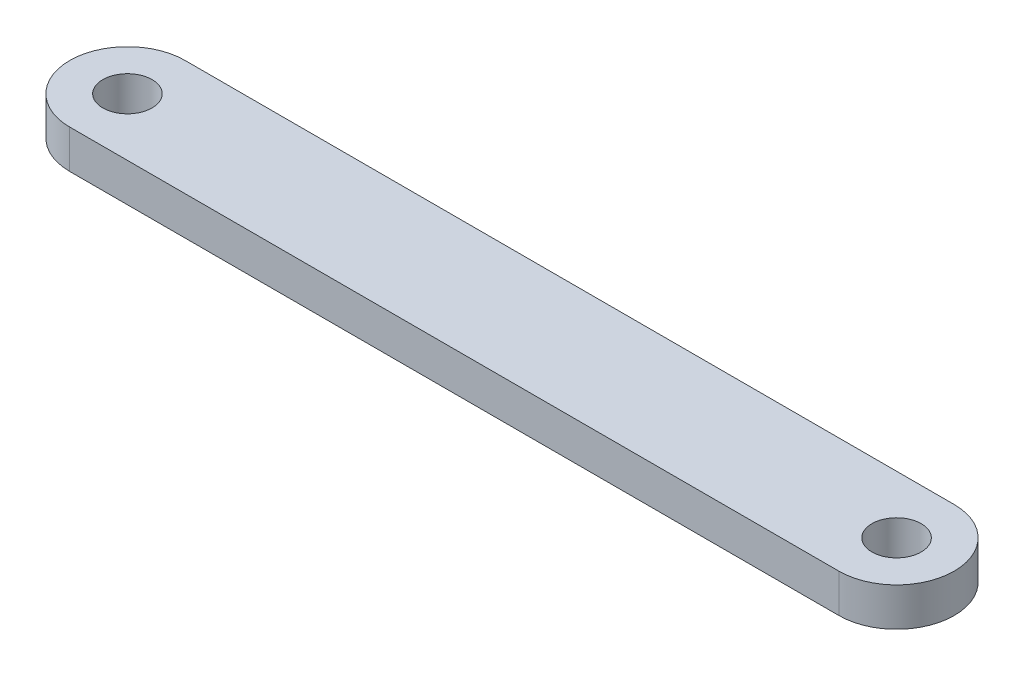
ISO-10303-21;
HEADER;
FILE_DESCRIPTION(('STEP AP214'),'2;1');
FILE_NAME('part.step','',(''),(''),'','','');
FILE_SCHEMA(('AUTOMOTIVE_DESIGN { 1 0 10303 214 1 1 1 1 }'));
ENDSEC;
DATA;
#1=APPLICATION_CONTEXT('core data for automotive mechanical design processes');
#2=APPLICATION_PROTOCOL_DEFINITION('international standard','automotive_design',2000,#1);
#3=PRODUCT_CONTEXT('',#1,'mechanical');
#4=PRODUCT('Part','Part','',(#3));
#5=PRODUCT_RELATED_PRODUCT_CATEGORY('part','',(#4));
#6=PRODUCT_DEFINITION_FORMATION('','',#4);
#7=PRODUCT_DEFINITION_CONTEXT('part definition',#1,'design');
#8=PRODUCT_DEFINITION('design','',#6,#7);
#9=PRODUCT_DEFINITION_SHAPE('','',#8);
#10=(LENGTH_UNIT() NAMED_UNIT(*) SI_UNIT(.MILLI.,.METRE.));
#11=(NAMED_UNIT(*) PLANE_ANGLE_UNIT() SI_UNIT($,.RADIAN.));
#12=(NAMED_UNIT(*) SI_UNIT($,.STERADIAN.) SOLID_ANGLE_UNIT());
#13=UNCERTAINTY_MEASURE_WITH_UNIT(LENGTH_MEASURE(1.E-05),#10,'distance_accuracy_value','');
#14=(GEOMETRIC_REPRESENTATION_CONTEXT(3) GLOBAL_UNCERTAINTY_ASSIGNED_CONTEXT((#13)) GLOBAL_UNIT_ASSIGNED_CONTEXT((#10,
#11,#12)) REPRESENTATION_CONTEXT('',''));
#15=CARTESIAN_POINT('',(0.,0.,0.));
#16=DIRECTION('',(0.,0.,1.));
#17=DIRECTION('',(1.,0.,0.));
#18=AXIS2_PLACEMENT_3D('',#15,#16,#17);
#19=CARTESIAN_POINT('',(0.,3.175,0.));
#20=DIRECTION('',(0.,1.,0.));
#21=DIRECTION('',(0.,0.,1.));
#22=AXIS2_PLACEMENT_3D('',#19,#20,#21);
#23=PLANE('',#22);
#24=CARTESIAN_POINT('',(-63.5,3.175,0.));
#25=DIRECTION('',(0.,1.,0.));
#26=DIRECTION('',(0.,0.,1.));
#27=AXIS2_PLACEMENT_3D('',#24,#25,#26);
#28=CIRCLE('',#27,2.032);
#29=CARTESIAN_POINT('',(-63.5,3.175,2.03200000000001));
#30=VERTEX_POINT('',#29);
#31=EDGE_CURVE('E130',#30,#30,#28,.T.);
#32=ORIENTED_EDGE('',*,*,#31,.F.);
#33=EDGE_LOOP('',(#32));
#34=FACE_BOUND('',#33,.T.);
#35=CARTESIAN_POINT('',(0.,3.175,0.));
#36=DIRECTION('',(0.,1.,0.));
#37=DIRECTION('',(0.,0.,1.));
#38=AXIS2_PLACEMENT_3D('',#35,#36,#37);
#39=CIRCLE('',#38,4.7625);
#40=CARTESIAN_POINT('',(0.,3.175,4.7625));
#41=VERTEX_POINT('',#40);
#42=CARTESIAN_POINT('',(0.,3.175,-4.7625));
#43=VERTEX_POINT('',#42);
#44=EDGE_CURVE('E110',#41,#43,#39,.T.);
#45=ORIENTED_EDGE('',*,*,#44,.T.);
#46=DIRECTION('',(-1.,0.,0.));
#47=VECTOR('',#46,1.);
#48=CARTESIAN_POINT('',(0.,3.175,-4.7625));
#49=LINE('',#48,#47);
#50=CARTESIAN_POINT('',(-63.5,3.175,-4.76249999999999));
#51=VERTEX_POINT('',#50);
#52=EDGE_CURVE('E105',#43,#51,#49,.T.);
#53=ORIENTED_EDGE('',*,*,#52,.T.);
#54=CARTESIAN_POINT('',(-63.5,3.175,0.));
#55=DIRECTION('',(0.,1.,0.));
#56=DIRECTION('',(0.,0.,1.));
#57=AXIS2_PLACEMENT_3D('',#54,#55,#56);
#58=CIRCLE('',#57,4.7625);
#59=CARTESIAN_POINT('',(-63.5,3.175,4.76250000000001));
#60=VERTEX_POINT('',#59);
#61=EDGE_CURVE('E108',#51,#60,#58,.T.);
#62=ORIENTED_EDGE('',*,*,#61,.T.);
#63=DIRECTION('',(1.,0.,0.));
#64=VECTOR('',#63,1.);
#65=CARTESIAN_POINT('',(0.,3.175,4.7625));
#66=LINE('',#65,#64);
#67=EDGE_CURVE('E70',#60,#41,#66,.T.);
#68=ORIENTED_EDGE('',*,*,#67,.T.);
#69=EDGE_LOOP('',(#45,#53,#62,#68));
#70=FACE_BOUND('',#69,.T.);
#71=CARTESIAN_POINT('',(0.,3.175,0.));
#72=DIRECTION('',(0.,1.,0.));
#73=DIRECTION('',(0.,0.,1.));
#74=AXIS2_PLACEMENT_3D('',#71,#72,#73);
#75=CIRCLE('',#74,2.032);
#76=CARTESIAN_POINT('',(0.,3.175,2.032));
#77=VERTEX_POINT('',#76);
#78=EDGE_CURVE('E152',#77,#77,#75,.T.);
#79=ORIENTED_EDGE('',*,*,#78,.F.);
#80=EDGE_LOOP('',(#79));
#81=FACE_BOUND('',#80,.T.);
#82=ADVANCED_FACE('F49',(#34,#70,#81),#23,.T.);
#83=CARTESIAN_POINT('',(0.,0.,0.));
#84=DIRECTION('',(0.,1.,0.));
#85=DIRECTION('',(0.,0.,1.));
#86=AXIS2_PLACEMENT_3D('',#83,#84,#85);
#87=PLANE('',#86);
#88=CARTESIAN_POINT('',(0.,0.,0.));
#89=DIRECTION('',(0.,1.,0.));
#90=DIRECTION('',(0.,0.,1.));
#91=AXIS2_PLACEMENT_3D('',#88,#89,#90);
#92=CIRCLE('',#91,4.7625);
#93=CARTESIAN_POINT('',(0.,0.,4.7625));
#94=VERTEX_POINT('',#93);
#95=CARTESIAN_POINT('',(0.,0.,-4.7625));
#96=VERTEX_POINT('',#95);
#97=EDGE_CURVE('E126',#94,#96,#92,.T.);
#98=ORIENTED_EDGE('',*,*,#97,.F.);
#99=DIRECTION('',(1.,0.,0.));
#100=VECTOR('',#99,1.);
#101=CARTESIAN_POINT('',(0.,0.,4.7625));
#102=LINE('',#101,#100);
#103=CARTESIAN_POINT('',(-63.5,0.,4.76250000000001));
#104=VERTEX_POINT('',#103);
#105=EDGE_CURVE('E98',#104,#94,#102,.T.);
#106=ORIENTED_EDGE('',*,*,#105,.F.);
#107=CARTESIAN_POINT('',(-63.5,0.,0.));
#108=DIRECTION('',(0.,1.,0.));
#109=DIRECTION('',(0.,0.,1.));
#110=AXIS2_PLACEMENT_3D('',#107,#108,#109);
#111=CIRCLE('',#110,4.7625);
#112=CARTESIAN_POINT('',(-63.5,0.,-4.76249999999999));
#113=VERTEX_POINT('',#112);
#114=EDGE_CURVE('E91',#113,#104,#111,.T.);
#115=ORIENTED_EDGE('',*,*,#114,.F.);
#116=DIRECTION('',(-1.,0.,0.));
#117=VECTOR('',#116,1.);
#118=CARTESIAN_POINT('',(0.,0.,-4.7625));
#119=LINE('',#118,#117);
#120=EDGE_CURVE('E115',#96,#113,#119,.T.);
#121=ORIENTED_EDGE('',*,*,#120,.F.);
#122=EDGE_LOOP('',(#98,#106,#115,#121));
#123=FACE_BOUND('',#122,.T.);
#124=CARTESIAN_POINT('',(-63.5,0.,0.));
#125=DIRECTION('',(0.,1.,0.));
#126=DIRECTION('',(0.,0.,1.));
#127=AXIS2_PLACEMENT_3D('',#124,#125,#126);
#128=CIRCLE('',#127,2.032);
#129=CARTESIAN_POINT('',(-63.5,0.,2.03200000000001));
#130=VERTEX_POINT('',#129);
#131=EDGE_CURVE('E148',#130,#130,#128,.T.);
#132=ORIENTED_EDGE('',*,*,#131,.T.);
#133=EDGE_LOOP('',(#132));
#134=FACE_BOUND('',#133,.T.);
#135=CARTESIAN_POINT('',(0.,0.,0.));
#136=DIRECTION('',(0.,1.,0.));
#137=DIRECTION('',(0.,0.,1.));
#138=AXIS2_PLACEMENT_3D('',#135,#136,#137);
#139=CIRCLE('',#138,2.032);
#140=CARTESIAN_POINT('',(0.,0.,2.032));
#141=VERTEX_POINT('',#140);
#142=EDGE_CURVE('E156',#141,#141,#139,.T.);
#143=ORIENTED_EDGE('',*,*,#142,.T.);
#144=EDGE_LOOP('',(#143));
#145=FACE_BOUND('',#144,.T.);
#146=ADVANCED_FACE('F143',(#123,#134,#145),#87,.F.);
#147=CARTESIAN_POINT('',(0.,3.175,0.));
#148=DIRECTION('',(0.,-1.,0.));
#149=DIRECTION('',(0.,0.,-1.));
#150=AXIS2_PLACEMENT_3D('',#147,#148,#149);
#151=CYLINDRICAL_SURFACE('',#150,4.7625);
#152=ORIENTED_EDGE('',*,*,#97,.T.);
#153=DIRECTION('',(0.,-1.,0.));
#154=VECTOR('',#153,1.);
#155=CARTESIAN_POINT('',(0.,3.175,-4.7625));
#156=LINE('',#155,#154);
#157=EDGE_CURVE('E11',#43,#96,#156,.T.);
#158=ORIENTED_EDGE('',*,*,#157,.F.);
#159=ORIENTED_EDGE('',*,*,#44,.F.);
#160=DIRECTION('',(0.,-1.,0.));
#161=VECTOR('',#160,1.);
#162=CARTESIAN_POINT('',(0.,3.175,4.7625));
#163=LINE('',#162,#161);
#164=EDGE_CURVE('E122',#41,#94,#163,.T.);
#165=ORIENTED_EDGE('',*,*,#164,.T.);
#166=EDGE_LOOP('',(#152,#158,#159,#165));
#167=FACE_BOUND('',#166,.T.);
#168=ADVANCED_FACE('F51',(#167),#151,.T.);
#169=CARTESIAN_POINT('',(0.,3.175,-4.7625));
#170=DIRECTION('',(0.,0.,1.));
#171=DIRECTION('',(1.,0.,0.));
#172=AXIS2_PLACEMENT_3D('',#169,#170,#171);
#173=PLANE('',#172);
#174=ORIENTED_EDGE('',*,*,#120,.T.);
#175=DIRECTION('',(0.,-1.,0.));
#176=VECTOR('',#175,1.);
#177=CARTESIAN_POINT('',(-63.5,3.175,-4.76249999999999));
#178=LINE('',#177,#176);
#179=EDGE_CURVE('E59',#51,#113,#178,.T.);
#180=ORIENTED_EDGE('',*,*,#179,.F.);
#181=ORIENTED_EDGE('',*,*,#52,.F.);
#182=ORIENTED_EDGE('',*,*,#157,.T.);
#183=EDGE_LOOP('',(#174,#180,#181,#182));
#184=FACE_BOUND('',#183,.T.);
#185=ADVANCED_FACE('F114',(#184),#173,.F.);
#186=CARTESIAN_POINT('',(-63.5,3.175,0.));
#187=DIRECTION('',(0.,-1.,0.));
#188=DIRECTION('',(0.,0.,-1.));
#189=AXIS2_PLACEMENT_3D('',#186,#187,#188);
#190=CYLINDRICAL_SURFACE('',#189,4.7625);
#191=ORIENTED_EDGE('',*,*,#114,.T.);
#192=DIRECTION('',(0.,-1.,0.));
#193=VECTOR('',#192,1.);
#194=CARTESIAN_POINT('',(-63.5,3.175,4.76250000000001));
#195=LINE('',#194,#193);
#196=EDGE_CURVE('E117',#60,#104,#195,.T.);
#197=ORIENTED_EDGE('',*,*,#196,.F.);
#198=ORIENTED_EDGE('',*,*,#61,.F.);
#199=ORIENTED_EDGE('',*,*,#179,.T.);
#200=EDGE_LOOP('',(#191,#197,#198,#199));
#201=FACE_BOUND('',#200,.T.);
#202=ADVANCED_FACE('F118',(#201),#190,.T.);
#203=CARTESIAN_POINT('',(0.,3.175,4.7625));
#204=DIRECTION('',(0.,0.,-1.));
#205=DIRECTION('',(-1.,0.,0.));
#206=AXIS2_PLACEMENT_3D('',#203,#204,#205);
#207=PLANE('',#206);
#208=ORIENTED_EDGE('',*,*,#105,.T.);
#209=ORIENTED_EDGE('',*,*,#164,.F.);
#210=ORIENTED_EDGE('',*,*,#67,.F.);
#211=ORIENTED_EDGE('',*,*,#196,.T.);
#212=EDGE_LOOP('',(#208,#209,#210,#211));
#213=FACE_BOUND('',#212,.T.);
#214=ADVANCED_FACE('F140',(#213),#207,.F.);
#215=CARTESIAN_POINT('',(-63.5,3.175,0.));
#216=DIRECTION('',(0.,-1.,0.));
#217=DIRECTION('',(0.,0.,-1.));
#218=AXIS2_PLACEMENT_3D('',#215,#216,#217);
#219=CYLINDRICAL_SURFACE('',#218,2.032);
#220=ORIENTED_EDGE('',*,*,#31,.T.);
#221=EDGE_LOOP('',(#220));
#222=FACE_BOUND('',#221,.T.);
#223=ORIENTED_EDGE('',*,*,#131,.F.);
#224=EDGE_LOOP('',(#223));
#225=FACE_BOUND('',#224,.T.);
#226=ADVANCED_FACE('F174',(#222,#225),#219,.F.);
#227=CARTESIAN_POINT('',(0.,3.175,0.));
#228=DIRECTION('',(0.,-1.,0.));
#229=DIRECTION('',(0.,0.,-1.));
#230=AXIS2_PLACEMENT_3D('',#227,#228,#229);
#231=CYLINDRICAL_SURFACE('',#230,2.032);
#232=ORIENTED_EDGE('',*,*,#78,.T.);
#233=EDGE_LOOP('',(#232));
#234=FACE_BOUND('',#233,.T.);
#235=ORIENTED_EDGE('',*,*,#142,.F.);
#236=EDGE_LOOP('',(#235));
#237=FACE_BOUND('',#236,.T.);
#238=ADVANCED_FACE('F164',(#234,#237),#231,.F.);
#239=CLOSED_SHELL('',(#82,#146,#168,#185,#202,#214,#226,#238));
#240=MANIFOLD_SOLID_BREP('B2',#239);
#241=ADVANCED_BREP_SHAPE_REPRESENTATION('',(#18,#240),#14);
#242=SHAPE_DEFINITION_REPRESENTATION(#9,#241);
ENDSEC;
END-ISO-10303-21;
